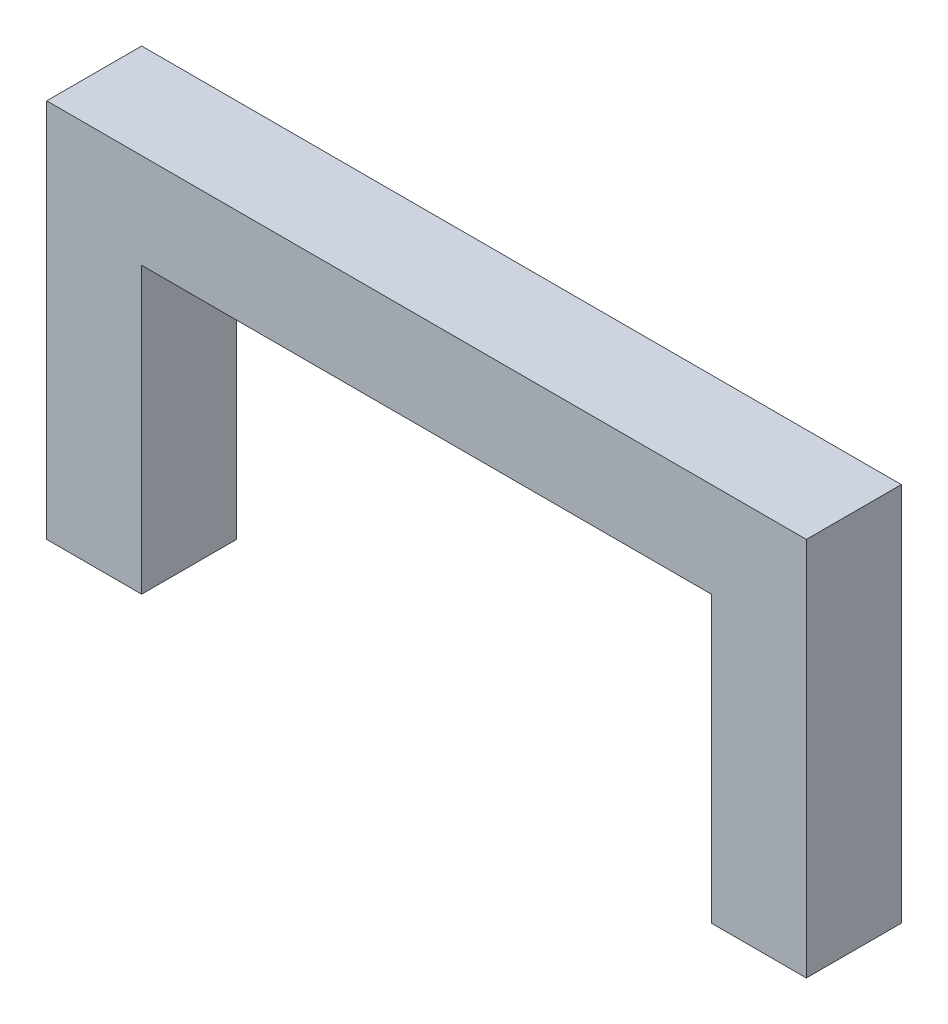
ISO-10303-21;
HEADER;
FILE_DESCRIPTION(('STEP AP214'),'2;1');
FILE_NAME('part.step','',(''),(''),'','','');
FILE_SCHEMA(('AUTOMOTIVE_DESIGN { 1 0 10303 214 1 1 1 1 }'));
ENDSEC;
DATA;
#1=APPLICATION_CONTEXT('core data for automotive mechanical design processes');
#2=APPLICATION_PROTOCOL_DEFINITION('international standard','automotive_design',2000,#1);
#3=PRODUCT_CONTEXT('',#1,'mechanical');
#4=PRODUCT('Part','Part','',(#3));
#5=PRODUCT_RELATED_PRODUCT_CATEGORY('part','',(#4));
#6=PRODUCT_DEFINITION_FORMATION('','',#4);
#7=PRODUCT_DEFINITION_CONTEXT('part definition',#1,'design');
#8=PRODUCT_DEFINITION('design','',#6,#7);
#9=PRODUCT_DEFINITION_SHAPE('','',#8);
#10=(LENGTH_UNIT() NAMED_UNIT(*) SI_UNIT(.MILLI.,.METRE.));
#11=(NAMED_UNIT(*) PLANE_ANGLE_UNIT() SI_UNIT($,.RADIAN.));
#12=(NAMED_UNIT(*) SI_UNIT($,.STERADIAN.) SOLID_ANGLE_UNIT());
#13=UNCERTAINTY_MEASURE_WITH_UNIT(LENGTH_MEASURE(1.E-05),#10,'distance_accuracy_value','');
#14=(GEOMETRIC_REPRESENTATION_CONTEXT(3) GLOBAL_UNCERTAINTY_ASSIGNED_CONTEXT((#13)) GLOBAL_UNIT_ASSIGNED_CONTEXT((#10,
#11,#12)) REPRESENTATION_CONTEXT('',''));
#15=CARTESIAN_POINT('',(0.,0.,0.));
#16=DIRECTION('',(0.,0.,1.));
#17=DIRECTION('',(1.,0.,0.));
#18=AXIS2_PLACEMENT_3D('',#15,#16,#17);
#19=CARTESIAN_POINT('',(42.0491166077738,0.,12.7));
#20=DIRECTION('',(-1.,0.,0.));
#21=DIRECTION('',(0.,0.,1.));
#22=AXIS2_PLACEMENT_3D('',#19,#20,#21);
#23=PLANE('',#22);
#24=DIRECTION('',(0.,1.,0.));
#25=VECTOR('',#24,1.);
#26=CARTESIAN_POINT('',(42.0491166077738,0.,0.));
#27=LINE('',#26,#25);
#28=CARTESIAN_POINT('',(42.0491166077738,-39.9848056537102,0.));
#29=VERTEX_POINT('',#28);
#30=CARTESIAN_POINT('',(42.0491166077738,-1.88480565371025,0.));
#31=VERTEX_POINT('',#30);
#32=EDGE_CURVE('E142',#29,#31,#27,.T.);
#33=ORIENTED_EDGE('',*,*,#32,.F.);
#34=DIRECTION('',(0.,0.,-1.));
#35=VECTOR('',#34,1.);
#36=CARTESIAN_POINT('',(42.0491166077738,-39.9848056537102,12.7));
#37=LINE('',#36,#35);
#38=CARTESIAN_POINT('',(42.0491166077738,-39.9848056537102,12.7));
#39=VERTEX_POINT('',#38);
#40=EDGE_CURVE('E11',#39,#29,#37,.T.);
#41=ORIENTED_EDGE('',*,*,#40,.F.);
#42=DIRECTION('',(0.,1.,0.));
#43=VECTOR('',#42,1.);
#44=CARTESIAN_POINT('',(42.0491166077738,0.,12.7));
#45=LINE('',#44,#43);
#46=CARTESIAN_POINT('',(42.0491166077738,-1.88480565371025,12.7));
#47=VERTEX_POINT('',#46);
#48=EDGE_CURVE('E166',#39,#47,#45,.T.);
#49=ORIENTED_EDGE('',*,*,#48,.T.);
#50=DIRECTION('',(0.,0.,-1.));
#51=VECTOR('',#50,1.);
#52=CARTESIAN_POINT('',(42.0491166077738,-1.88480565371025,12.7));
#53=LINE('',#52,#51);
#54=EDGE_CURVE('E93',#47,#31,#53,.T.);
#55=ORIENTED_EDGE('',*,*,#54,.T.);
#56=EDGE_LOOP('',(#33,#41,#49,#55));
#57=FACE_BOUND('',#56,.T.);
#58=ADVANCED_FACE('F41',(#57),#23,.T.);
#59=CARTESIAN_POINT('',(0.,-39.9848056537102,12.7));
#60=DIRECTION('',(0.,1.,0.));
#61=DIRECTION('',(0.,0.,1.));
#62=AXIS2_PLACEMENT_3D('',#59,#60,#61);
#63=PLANE('',#62);
#64=DIRECTION('',(1.,0.,0.));
#65=VECTOR('',#64,1.);
#66=CARTESIAN_POINT('',(0.,-39.9848056537102,0.));
#67=LINE('',#66,#65);
#68=CARTESIAN_POINT('',(54.7491166077738,-39.9848056537102,0.));
#69=VERTEX_POINT('',#68);
#70=EDGE_CURVE('E146',#29,#69,#67,.T.);
#71=ORIENTED_EDGE('',*,*,#70,.T.);
#72=DIRECTION('',(0.,0.,-1.));
#73=VECTOR('',#72,1.);
#74=CARTESIAN_POINT('',(54.7491166077738,-39.9848056537102,12.7));
#75=LINE('',#74,#73);
#76=CARTESIAN_POINT('',(54.7491166077738,-39.9848056537102,12.7));
#77=VERTEX_POINT('',#76);
#78=EDGE_CURVE('E50',#77,#69,#75,.T.);
#79=ORIENTED_EDGE('',*,*,#78,.F.);
#80=DIRECTION('',(1.,0.,0.));
#81=VECTOR('',#80,1.);
#82=CARTESIAN_POINT('',(0.,-39.9848056537102,12.7));
#83=LINE('',#82,#81);
#84=EDGE_CURVE('E125',#39,#77,#83,.T.);
#85=ORIENTED_EDGE('',*,*,#84,.F.);
#86=ORIENTED_EDGE('',*,*,#40,.T.);
#87=EDGE_LOOP('',(#71,#79,#85,#86));
#88=FACE_BOUND('',#87,.T.);
#89=ADVANCED_FACE('F188',(#88),#63,.F.);
#90=CARTESIAN_POINT('',(54.7491166077738,0.,12.7));
#91=DIRECTION('',(1.,0.,0.));
#92=DIRECTION('',(0.,1.,0.));
#93=AXIS2_PLACEMENT_3D('',#90,#91,#92);
#94=PLANE('',#93);
#95=DIRECTION('',(0.,-1.,0.));
#96=VECTOR('',#95,1.);
#97=CARTESIAN_POINT('',(54.7491166077738,0.,0.));
#98=LINE('',#97,#96);
#99=CARTESIAN_POINT('',(54.7491166077738,10.8151943462898,0.));
#100=VERTEX_POINT('',#99);
#101=EDGE_CURVE('E150',#100,#69,#98,.T.);
#102=ORIENTED_EDGE('',*,*,#101,.F.);
#103=DIRECTION('',(0.,0.,-1.));
#104=VECTOR('',#103,1.);
#105=CARTESIAN_POINT('',(54.7491166077738,10.8151943462898,12.7));
#106=LINE('',#105,#104);
#107=CARTESIAN_POINT('',(54.7491166077738,10.8151943462898,12.7));
#108=VERTEX_POINT('',#107);
#109=EDGE_CURVE('E176',#108,#100,#106,.T.);
#110=ORIENTED_EDGE('',*,*,#109,.F.);
#111=DIRECTION('',(0.,-1.,0.));
#112=VECTOR('',#111,1.);
#113=CARTESIAN_POINT('',(54.7491166077738,0.,12.7));
#114=LINE('',#113,#112);
#115=EDGE_CURVE('E185',#108,#77,#114,.T.);
#116=ORIENTED_EDGE('',*,*,#115,.T.);
#117=ORIENTED_EDGE('',*,*,#78,.T.);
#118=EDGE_LOOP('',(#102,#110,#116,#117));
#119=FACE_BOUND('',#118,.T.);
#120=ADVANCED_FACE('F183',(#119),#94,.T.);
#121=CARTESIAN_POINT('',(0.,10.8151943462898,12.7));
#122=DIRECTION('',(0.,1.,0.));
#123=DIRECTION('',(0.,0.,1.));
#124=AXIS2_PLACEMENT_3D('',#121,#122,#123);
#125=PLANE('',#124);
#126=DIRECTION('',(1.,0.,0.));
#127=VECTOR('',#126,1.);
#128=CARTESIAN_POINT('',(0.,10.8151943462898,0.));
#129=LINE('',#128,#127);
#130=CARTESIAN_POINT('',(-46.8508833922262,10.8151943462898,0.));
#131=VERTEX_POINT('',#130);
#132=EDGE_CURVE('E154',#131,#100,#129,.T.);
#133=ORIENTED_EDGE('',*,*,#132,.F.);
#134=DIRECTION('',(0.,0.,-1.));
#135=VECTOR('',#134,1.);
#136=CARTESIAN_POINT('',(-46.8508833922262,10.8151943462898,12.7));
#137=LINE('',#136,#135);
#138=CARTESIAN_POINT('',(-46.8508833922262,10.8151943462898,12.7));
#139=VERTEX_POINT('',#138);
#140=EDGE_CURVE('E173',#139,#131,#137,.T.);
#141=ORIENTED_EDGE('',*,*,#140,.F.);
#142=DIRECTION('',(1.,0.,0.));
#143=VECTOR('',#142,1.);
#144=CARTESIAN_POINT('',(0.,10.8151943462898,12.7));
#145=LINE('',#144,#143);
#146=EDGE_CURVE('E196',#139,#108,#145,.T.);
#147=ORIENTED_EDGE('',*,*,#146,.T.);
#148=ORIENTED_EDGE('',*,*,#109,.T.);
#149=EDGE_LOOP('',(#133,#141,#147,#148));
#150=FACE_BOUND('',#149,.T.);
#151=ADVANCED_FACE('F194',(#150),#125,.T.);
#152=CARTESIAN_POINT('',(-46.8508833922262,0.,12.7));
#153=DIRECTION('',(1.,0.,0.));
#154=DIRECTION('',(0.,1.,0.));
#155=AXIS2_PLACEMENT_3D('',#152,#153,#154);
#156=PLANE('',#155);
#157=DIRECTION('',(0.,-1.,0.));
#158=VECTOR('',#157,1.);
#159=CARTESIAN_POINT('',(-46.8508833922262,0.,0.));
#160=LINE('',#159,#158);
#161=CARTESIAN_POINT('',(-46.8508833922262,-39.9848056537102,0.));
#162=VERTEX_POINT('',#161);
#163=EDGE_CURVE('E158',#131,#162,#160,.T.);
#164=ORIENTED_EDGE('',*,*,#163,.T.);
#165=DIRECTION('',(0.,0.,-1.));
#166=VECTOR('',#165,1.);
#167=CARTESIAN_POINT('',(-46.8508833922262,-39.9848056537102,12.7));
#168=LINE('',#167,#166);
#169=CARTESIAN_POINT('',(-46.8508833922262,-39.9848056537102,12.7));
#170=VERTEX_POINT('',#169);
#171=EDGE_CURVE('E131',#170,#162,#168,.T.);
#172=ORIENTED_EDGE('',*,*,#171,.F.);
#173=DIRECTION('',(0.,-1.,0.));
#174=VECTOR('',#173,1.);
#175=CARTESIAN_POINT('',(-46.8508833922262,0.,12.7));
#176=LINE('',#175,#174);
#177=EDGE_CURVE('E119',#139,#170,#176,.T.);
#178=ORIENTED_EDGE('',*,*,#177,.F.);
#179=ORIENTED_EDGE('',*,*,#140,.T.);
#180=EDGE_LOOP('',(#164,#172,#178,#179));
#181=FACE_BOUND('',#180,.T.);
#182=ADVANCED_FACE('F214',(#181),#156,.F.);
#183=CARTESIAN_POINT('',(-34.1508833922262,-39.9848056537102,0.));
#184=VERTEX_POINT('',#183);
#185=EDGE_CURVE('E129',#162,#184,#67,.T.);
#186=ORIENTED_EDGE('',*,*,#185,.T.);
#187=DIRECTION('',(0.,0.,-1.));
#188=VECTOR('',#187,1.);
#189=CARTESIAN_POINT('',(-34.1508833922262,-39.9848056537102,12.7));
#190=LINE('',#189,#188);
#191=CARTESIAN_POINT('',(-34.1508833922262,-39.9848056537102,12.7));
#192=VERTEX_POINT('',#191);
#193=EDGE_CURVE('E126',#192,#184,#190,.T.);
#194=ORIENTED_EDGE('',*,*,#193,.F.);
#195=EDGE_CURVE('E112',#170,#192,#83,.T.);
#196=ORIENTED_EDGE('',*,*,#195,.F.);
#197=ORIENTED_EDGE('',*,*,#171,.T.);
#198=EDGE_LOOP('',(#186,#194,#196,#197));
#199=FACE_BOUND('',#198,.T.);
#200=ADVANCED_FACE('F127',(#199),#63,.F.);
#201=CARTESIAN_POINT('',(-34.1508833922262,0.,12.7));
#202=DIRECTION('',(-1.,0.,0.));
#203=DIRECTION('',(0.,0.,1.));
#204=AXIS2_PLACEMENT_3D('',#201,#202,#203);
#205=PLANE('',#204);
#206=DIRECTION('',(0.,1.,0.));
#207=VECTOR('',#206,1.);
#208=CARTESIAN_POINT('',(-34.1508833922262,0.,0.));
#209=LINE('',#208,#207);
#210=CARTESIAN_POINT('',(-34.1508833922262,-1.88480565371025,0.));
#211=VERTEX_POINT('',#210);
#212=EDGE_CURVE('E86',#184,#211,#209,.T.);
#213=ORIENTED_EDGE('',*,*,#212,.T.);
#214=DIRECTION('',(0.,0.,-1.));
#215=VECTOR('',#214,1.);
#216=CARTESIAN_POINT('',(-34.1508833922262,-1.88480565371025,12.7));
#217=LINE('',#216,#215);
#218=CARTESIAN_POINT('',(-34.1508833922262,-1.88480565371025,12.7));
#219=VERTEX_POINT('',#218);
#220=EDGE_CURVE('E132',#219,#211,#217,.T.);
#221=ORIENTED_EDGE('',*,*,#220,.F.);
#222=DIRECTION('',(0.,1.,0.));
#223=VECTOR('',#222,1.);
#224=CARTESIAN_POINT('',(-34.1508833922262,0.,12.7));
#225=LINE('',#224,#223);
#226=EDGE_CURVE('E116',#192,#219,#225,.T.);
#227=ORIENTED_EDGE('',*,*,#226,.F.);
#228=ORIENTED_EDGE('',*,*,#193,.T.);
#229=EDGE_LOOP('',(#213,#221,#227,#228));
#230=FACE_BOUND('',#229,.T.);
#231=ADVANCED_FACE('F134',(#230),#205,.F.);
#232=CARTESIAN_POINT('',(0.,-1.88480565371025,12.7));
#233=DIRECTION('',(0.,1.,0.));
#234=DIRECTION('',(0.,0.,1.));
#235=AXIS2_PLACEMENT_3D('',#232,#233,#234);
#236=PLANE('',#235);
#237=DIRECTION('',(1.,0.,0.));
#238=VECTOR('',#237,1.);
#239=CARTESIAN_POINT('',(0.,-1.88480565371025,0.));
#240=LINE('',#239,#238);
#241=EDGE_CURVE('E163',#211,#31,#240,.T.);
#242=ORIENTED_EDGE('',*,*,#241,.T.);
#243=ORIENTED_EDGE('',*,*,#54,.F.);
#244=DIRECTION('',(1.,0.,0.));
#245=VECTOR('',#244,1.);
#246=CARTESIAN_POINT('',(0.,-1.88480565371025,12.7));
#247=LINE('',#246,#245);
#248=EDGE_CURVE('E58',#219,#47,#247,.T.);
#249=ORIENTED_EDGE('',*,*,#248,.F.);
#250=ORIENTED_EDGE('',*,*,#220,.T.);
#251=EDGE_LOOP('',(#242,#243,#249,#250));
#252=FACE_BOUND('',#251,.T.);
#253=ADVANCED_FACE('F219',(#252),#236,.F.);
#254=CARTESIAN_POINT('',(0.,0.,12.7));
#255=DIRECTION('',(0.,0.,1.));
#256=DIRECTION('',(1.,0.,0.));
#257=AXIS2_PLACEMENT_3D('',#254,#255,#256);
#258=PLANE('',#257);
#259=ORIENTED_EDGE('',*,*,#48,.F.);
#260=ORIENTED_EDGE('',*,*,#84,.T.);
#261=ORIENTED_EDGE('',*,*,#115,.F.);
#262=ORIENTED_EDGE('',*,*,#146,.F.);
#263=ORIENTED_EDGE('',*,*,#177,.T.);
#264=ORIENTED_EDGE('',*,*,#195,.T.);
#265=ORIENTED_EDGE('',*,*,#226,.T.);
#266=ORIENTED_EDGE('',*,*,#248,.T.);
#267=EDGE_LOOP('',(#259,#260,#261,#262,#263,#264,#265,#266));
#268=FACE_BOUND('',#267,.T.);
#269=ADVANCED_FACE('F114',(#268),#258,.T.);
#270=CARTESIAN_POINT('',(0.,0.,0.));
#271=DIRECTION('',(0.,0.,1.));
#272=DIRECTION('',(1.,0.,0.));
#273=AXIS2_PLACEMENT_3D('',#270,#271,#272);
#274=PLANE('',#273);
#275=ORIENTED_EDGE('',*,*,#32,.T.);
#276=ORIENTED_EDGE('',*,*,#241,.F.);
#277=ORIENTED_EDGE('',*,*,#212,.F.);
#278=ORIENTED_EDGE('',*,*,#185,.F.);
#279=ORIENTED_EDGE('',*,*,#163,.F.);
#280=ORIENTED_EDGE('',*,*,#132,.T.);
#281=ORIENTED_EDGE('',*,*,#101,.T.);
#282=ORIENTED_EDGE('',*,*,#70,.F.);
#283=EDGE_LOOP('',(#275,#276,#277,#278,#279,#280,#281,#282));
#284=FACE_BOUND('',#283,.T.);
#285=ADVANCED_FACE('F190',(#284),#274,.F.);
#286=CLOSED_SHELL('',(#58,#89,#120,#151,#182,#200,#231,#253,#269,#285));
#287=MANIFOLD_SOLID_BREP('B2',#286);
#288=ADVANCED_BREP_SHAPE_REPRESENTATION('',(#18,#287),#14);
#289=SHAPE_DEFINITION_REPRESENTATION(#9,#288);
ENDSEC;
END-ISO-10303-21;
